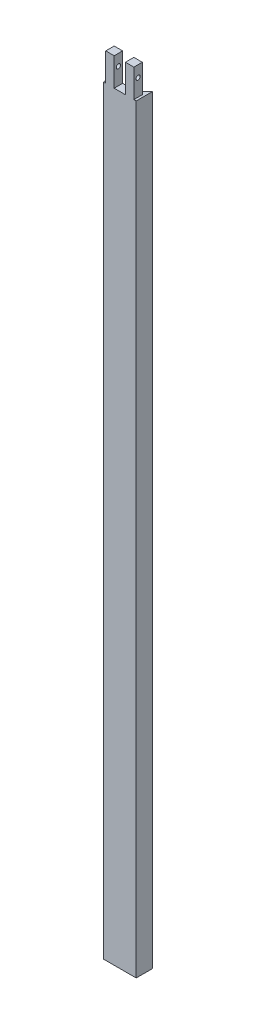
ISO-10303-21;
HEADER;
FILE_DESCRIPTION(('STEP AP214'),'2;1');
FILE_NAME('part.step','',(''),(''),'','','');
FILE_SCHEMA(('AUTOMOTIVE_DESIGN { 1 0 10303 214 1 1 1 1 }'));
ENDSEC;
DATA;
#1=APPLICATION_CONTEXT('core data for automotive mechanical design processes');
#2=APPLICATION_PROTOCOL_DEFINITION('international standard','automotive_design',2000,#1);
#3=PRODUCT_CONTEXT('',#1,'mechanical');
#4=PRODUCT('Part','Part','',(#3));
#5=PRODUCT_RELATED_PRODUCT_CATEGORY('part','',(#4));
#6=PRODUCT_DEFINITION_FORMATION('','',#4);
#7=PRODUCT_DEFINITION_CONTEXT('part definition',#1,'design');
#8=PRODUCT_DEFINITION('design','',#6,#7);
#9=PRODUCT_DEFINITION_SHAPE('','',#8);
#10=(LENGTH_UNIT() NAMED_UNIT(*) SI_UNIT(.MILLI.,.METRE.));
#11=(NAMED_UNIT(*) PLANE_ANGLE_UNIT() SI_UNIT($,.RADIAN.));
#12=(NAMED_UNIT(*) SI_UNIT($,.STERADIAN.) SOLID_ANGLE_UNIT());
#13=UNCERTAINTY_MEASURE_WITH_UNIT(LENGTH_MEASURE(1.E-05),#10,'distance_accuracy_value','');
#14=(GEOMETRIC_REPRESENTATION_CONTEXT(3) GLOBAL_UNCERTAINTY_ASSIGNED_CONTEXT((#13)) GLOBAL_UNIT_ASSIGNED_CONTEXT((#10,
#11,#12)) REPRESENTATION_CONTEXT('',''));
#15=CARTESIAN_POINT('',(0.,0.,0.));
#16=DIRECTION('',(0.,0.,1.));
#17=DIRECTION('',(1.,0.,0.));
#18=AXIS2_PLACEMENT_3D('',#15,#16,#17);
#19=CARTESIAN_POINT('',(0.,0.,3.));
#20=DIRECTION('',(0.,-1.,0.));
#21=DIRECTION('',(1.,0.,0.));
#22=AXIS2_PLACEMENT_3D('',#19,#20,#21);
#23=PLANE('',#22);
#24=DIRECTION('',(0.,0.,-1.));
#25=VECTOR('',#24,1.);
#26=CARTESIAN_POINT('',(2.00000000000002,0.,3.));
#27=LINE('',#26,#25);
#28=CARTESIAN_POINT('',(2.00000000000002,0.,3.));
#29=VERTEX_POINT('',#28);
#30=CARTESIAN_POINT('',(2.00000000000002,0.,0.));
#31=VERTEX_POINT('',#30);
#32=EDGE_CURVE('E169',#29,#31,#27,.T.);
#33=ORIENTED_EDGE('',*,*,#32,.F.);
#34=DIRECTION('',(-1.,0.,0.));
#35=VECTOR('',#34,1.);
#36=CARTESIAN_POINT('',(0.,0.,3.));
#37=LINE('',#36,#35);
#38=CARTESIAN_POINT('',(2.82842712474618,0.,3.));
#39=VERTEX_POINT('',#38);
#40=EDGE_CURVE('E261',#39,#29,#37,.T.);
#41=ORIENTED_EDGE('',*,*,#40,.F.);
#42=DIRECTION('',(0.,0.,1.));
#43=VECTOR('',#42,1.);
#44=CARTESIAN_POINT('',(2.82842712474619,0.,-2.82842712474619));
#45=LINE('',#44,#43);
#46=CARTESIAN_POINT('',(2.82842712474619,0.,-2.82842712474619));
#47=VERTEX_POINT('',#46);
#48=EDGE_CURVE('E242',#47,#39,#45,.T.);
#49=ORIENTED_EDGE('',*,*,#48,.F.);
#50=DIRECTION('',(0.707106781186546,0.,-0.707106781186549));
#51=VECTOR('',#50,1.);
#52=CARTESIAN_POINT('',(0.,0.,0.));
#53=LINE('',#52,#51);
#54=CARTESIAN_POINT('',(0.,0.,0.));
#55=VERTEX_POINT('',#54);
#56=EDGE_CURVE('E238',#55,#47,#53,.T.);
#57=ORIENTED_EDGE('',*,*,#56,.F.);
#58=DIRECTION('',(-1.,0.,0.));
#59=VECTOR('',#58,1.);
#60=CARTESIAN_POINT('',(2.00000000000002,0.,0.));
#61=LINE('',#60,#59);
#62=EDGE_CURVE('E57',#31,#55,#61,.T.);
#63=ORIENTED_EDGE('',*,*,#62,.F.);
#64=EDGE_LOOP('',(#33,#41,#49,#57,#63));
#65=FACE_BOUND('',#64,.T.);
#66=ADVANCED_FACE('F39',(#65),#23,.F.);
#67=DIRECTION('',(0.,0.,1.));
#68=VECTOR('',#67,1.);
#69=CARTESIAN_POINT('',(-0.999999999999984,0.,3.));
#70=LINE('',#69,#68);
#71=CARTESIAN_POINT('',(-0.999999999999984,0.,0.));
#72=VERTEX_POINT('',#71);
#73=CARTESIAN_POINT('',(-0.999999999999984,0.,3.));
#74=VERTEX_POINT('',#73);
#75=EDGE_CURVE('E166',#72,#74,#70,.T.);
#76=ORIENTED_EDGE('',*,*,#75,.F.);
#77=DIRECTION('',(-1.,0.,0.));
#78=VECTOR('',#77,1.);
#79=CARTESIAN_POINT('',(0.,0.,0.));
#80=LINE('',#79,#78);
#81=CARTESIAN_POINT('',(-4.99999999999998,0.,0.));
#82=VERTEX_POINT('',#81);
#83=EDGE_CURVE('E270',#72,#82,#80,.T.);
#84=ORIENTED_EDGE('',*,*,#83,.T.);
#85=DIRECTION('',(0.,0.,-1.));
#86=VECTOR('',#85,1.);
#87=CARTESIAN_POINT('',(-4.99999999999998,0.,3.));
#88=LINE('',#87,#86);
#89=CARTESIAN_POINT('',(-4.99999999999998,0.,3.));
#90=VERTEX_POINT('',#89);
#91=EDGE_CURVE('E176',#90,#82,#88,.T.);
#92=ORIENTED_EDGE('',*,*,#91,.F.);
#93=EDGE_CURVE('E65',#74,#90,#37,.T.);
#94=ORIENTED_EDGE('',*,*,#93,.F.);
#95=EDGE_LOOP('',(#76,#84,#92,#94));
#96=FACE_BOUND('',#95,.T.);
#97=ADVANCED_FACE('F290',(#96),#23,.F.);
#98=DIRECTION('',(0.,0.,1.));
#99=VECTOR('',#98,1.);
#100=CARTESIAN_POINT('',(-7.99999999999999,0.,3.));
#101=LINE('',#100,#99);
#102=CARTESIAN_POINT('',(-7.99999999999998,0.,0.));
#103=VERTEX_POINT('',#102);
#104=CARTESIAN_POINT('',(-7.99999999999999,0.,3.));
#105=VERTEX_POINT('',#104);
#106=EDGE_CURVE('E171',#103,#105,#101,.T.);
#107=ORIENTED_EDGE('',*,*,#106,.F.);
#108=DIRECTION('',(-1.,0.,0.));
#109=VECTOR('',#108,1.);
#110=CARTESIAN_POINT('',(-7.99999999999998,0.,0.));
#111=LINE('',#110,#109);
#112=CARTESIAN_POINT('',(-5.99999999999997,0.,0.));
#113=VERTEX_POINT('',#112);
#114=EDGE_CURVE('E11',#113,#103,#111,.T.);
#115=ORIENTED_EDGE('',*,*,#114,.F.);
#116=DIRECTION('',(0.707106781186546,0.,0.707106781186549));
#117=VECTOR('',#116,1.);
#118=CARTESIAN_POINT('',(-5.99999999999997,0.,0.));
#119=LINE('',#118,#117);
#120=CARTESIAN_POINT('',(-8.82842712474615,0.,-2.8284271247462));
#121=VERTEX_POINT('',#120);
#122=EDGE_CURVE('E219',#121,#113,#119,.T.);
#123=ORIENTED_EDGE('',*,*,#122,.F.);
#124=DIRECTION('',(0.,0.,-1.));
#125=VECTOR('',#124,1.);
#126=CARTESIAN_POINT('',(-8.82842712474615,0.,-2.8284271247462));
#127=LINE('',#126,#125);
#128=CARTESIAN_POINT('',(-8.82842712474615,0.,3.));
#129=VERTEX_POINT('',#128);
#130=EDGE_CURVE('E215',#129,#121,#127,.T.);
#131=ORIENTED_EDGE('',*,*,#130,.F.);
#132=EDGE_CURVE('E265',#105,#129,#37,.T.);
#133=ORIENTED_EDGE('',*,*,#132,.F.);
#134=EDGE_LOOP('',(#107,#115,#123,#131,#133));
#135=FACE_BOUND('',#134,.T.);
#136=ADVANCED_FACE('F41',(#135),#23,.F.);
#137=CARTESIAN_POINT('',(0.,-270.,3.));
#138=DIRECTION('',(0.,1.,0.));
#139=DIRECTION('',(0.,0.,1.));
#140=AXIS2_PLACEMENT_3D('',#137,#138,#139);
#141=PLANE('',#140);
#142=DIRECTION('',(1.,0.,0.));
#143=VECTOR('',#142,1.);
#144=CARTESIAN_POINT('',(0.,-270.,0.));
#145=LINE('',#144,#143);
#146=CARTESIAN_POINT('',(-5.99999999999997,-270.,0.));
#147=VERTEX_POINT('',#146);
#148=CARTESIAN_POINT('',(0.,-270.,0.));
#149=VERTEX_POINT('',#148);
#150=EDGE_CURVE('E276',#147,#149,#145,.T.);
#151=ORIENTED_EDGE('',*,*,#150,.T.);
#152=DIRECTION('',(0.707106781186546,0.,-0.707106781186549));
#153=VECTOR('',#152,1.);
#154=CARTESIAN_POINT('',(0.,-270.,0.));
#155=LINE('',#154,#153);
#156=CARTESIAN_POINT('',(2.82842712474619,-270.,-2.82842712474619));
#157=VERTEX_POINT('',#156);
#158=EDGE_CURVE('E235',#149,#157,#155,.T.);
#159=ORIENTED_EDGE('',*,*,#158,.T.);
#160=DIRECTION('',(0.,0.,1.));
#161=VECTOR('',#160,1.);
#162=CARTESIAN_POINT('',(2.82842712474619,-270.,-2.82842712474619));
#163=LINE('',#162,#161);
#164=CARTESIAN_POINT('',(2.82842712474618,-270.,3.));
#165=VERTEX_POINT('',#164);
#166=EDGE_CURVE('E243',#157,#165,#163,.T.);
#167=ORIENTED_EDGE('',*,*,#166,.T.);
#168=DIRECTION('',(1.,0.,0.));
#169=VECTOR('',#168,1.);
#170=CARTESIAN_POINT('',(0.,-270.,3.));
#171=LINE('',#170,#169);
#172=CARTESIAN_POINT('',(-8.82842712474615,-270.,3.));
#173=VERTEX_POINT('',#172);
#174=EDGE_CURVE('E49',#173,#165,#171,.T.);
#175=ORIENTED_EDGE('',*,*,#174,.F.);
#176=DIRECTION('',(0.,0.,-1.));
#177=VECTOR('',#176,1.);
#178=CARTESIAN_POINT('',(-8.82842712474615,-270.,-2.8284271247462));
#179=LINE('',#178,#177);
#180=CARTESIAN_POINT('',(-8.82842712474615,-270.,-2.8284271247462));
#181=VERTEX_POINT('',#180);
#182=EDGE_CURVE('E214',#173,#181,#179,.T.);
#183=ORIENTED_EDGE('',*,*,#182,.T.);
#184=DIRECTION('',(0.707106781186546,0.,0.707106781186549));
#185=VECTOR('',#184,1.);
#186=CARTESIAN_POINT('',(-5.99999999999997,-270.,0.));
#187=LINE('',#186,#185);
#188=EDGE_CURVE('E220',#181,#147,#187,.T.);
#189=ORIENTED_EDGE('',*,*,#188,.T.);
#190=EDGE_LOOP('',(#151,#159,#167,#175,#183,#189));
#191=FACE_BOUND('',#190,.T.);
#192=ADVANCED_FACE('F317',(#191),#141,.F.);
#193=CARTESIAN_POINT('',(0.,0.,3.));
#194=DIRECTION('',(0.,0.,-1.));
#195=DIRECTION('',(-1.,0.,0.));
#196=AXIS2_PLACEMENT_3D('',#193,#194,#195);
#197=PLANE('',#196);
#198=ORIENTED_EDGE('',*,*,#174,.T.);
#199=DIRECTION('',(0.,-1.,0.));
#200=VECTOR('',#199,1.);
#201=CARTESIAN_POINT('',(2.82842712474618,0.,3.));
#202=LINE('',#201,#200);
#203=EDGE_CURVE('E254',#39,#165,#202,.T.);
#204=ORIENTED_EDGE('',*,*,#203,.F.);
#205=ORIENTED_EDGE('',*,*,#40,.T.);
#206=DIRECTION('',(0.,-1.,0.));
#207=VECTOR('',#206,1.);
#208=CARTESIAN_POINT('',(2.00000000000002,10.,3.));
#209=LINE('',#208,#207);
#210=CARTESIAN_POINT('',(2.00000000000002,10.,3.));
#211=VERTEX_POINT('',#210);
#212=EDGE_CURVE('E320',#211,#29,#209,.T.);
#213=ORIENTED_EDGE('',*,*,#212,.F.);
#214=DIRECTION('',(1.,0.,0.));
#215=VECTOR('',#214,1.);
#216=CARTESIAN_POINT('',(2.00000000000002,10.,3.));
#217=LINE('',#216,#215);
#218=CARTESIAN_POINT('',(-0.999999999999986,10.,3.));
#219=VERTEX_POINT('',#218);
#220=EDGE_CURVE('E161',#219,#211,#217,.T.);
#221=ORIENTED_EDGE('',*,*,#220,.F.);
#222=DIRECTION('',(0.,-1.,0.));
#223=VECTOR('',#222,1.);
#224=CARTESIAN_POINT('',(-0.999999999999986,10.,3.));
#225=LINE('',#224,#223);
#226=EDGE_CURVE('E178',#219,#74,#225,.T.);
#227=ORIENTED_EDGE('',*,*,#226,.T.);
#228=ORIENTED_EDGE('',*,*,#93,.T.);
#229=DIRECTION('',(0.,-1.,0.));
#230=VECTOR('',#229,1.);
#231=CARTESIAN_POINT('',(-4.99999999999999,10.,3.));
#232=LINE('',#231,#230);
#233=CARTESIAN_POINT('',(-4.99999999999999,10.,3.));
#234=VERTEX_POINT('',#233);
#235=EDGE_CURVE('E206',#234,#90,#232,.T.);
#236=ORIENTED_EDGE('',*,*,#235,.F.);
#237=DIRECTION('',(1.,0.,0.));
#238=VECTOR('',#237,1.);
#239=CARTESIAN_POINT('',(-7.99999999999999,10.,3.));
#240=LINE('',#239,#238);
#241=CARTESIAN_POINT('',(-7.99999999999999,10.,3.));
#242=VERTEX_POINT('',#241);
#243=EDGE_CURVE('E186',#242,#234,#240,.T.);
#244=ORIENTED_EDGE('',*,*,#243,.F.);
#245=DIRECTION('',(0.,-1.,0.));
#246=VECTOR('',#245,1.);
#247=CARTESIAN_POINT('',(-7.99999999999999,10.,3.));
#248=LINE('',#247,#246);
#249=EDGE_CURVE('E210',#242,#105,#248,.T.);
#250=ORIENTED_EDGE('',*,*,#249,.T.);
#251=ORIENTED_EDGE('',*,*,#132,.T.);
#252=DIRECTION('',(0.,-1.,0.));
#253=VECTOR('',#252,1.);
#254=CARTESIAN_POINT('',(-8.82842712474615,0.,3.));
#255=LINE('',#254,#253);
#256=EDGE_CURVE('E231',#129,#173,#255,.T.);
#257=ORIENTED_EDGE('',*,*,#256,.T.);
#258=EDGE_LOOP('',(#198,#204,#205,#213,#221,#227,#228,#236,#244,#250,#251,#257));
#259=FACE_BOUND('',#258,.T.);
#260=ADVANCED_FACE('F287',(#259),#197,.F.);
#261=CARTESIAN_POINT('',(0.,0.,0.));
#262=DIRECTION('',(0.,0.,-1.));
#263=DIRECTION('',(-1.,0.,0.));
#264=AXIS2_PLACEMENT_3D('',#261,#262,#263);
#265=PLANE('',#264);
#266=DIRECTION('',(0.,1.,0.));
#267=VECTOR('',#266,1.);
#268=CARTESIAN_POINT('',(0.,0.,0.));
#269=LINE('',#268,#267);
#270=EDGE_CURVE('E258',#149,#55,#269,.T.);
#271=ORIENTED_EDGE('',*,*,#270,.F.);
#272=ORIENTED_EDGE('',*,*,#150,.F.);
#273=DIRECTION('',(0.,-1.,0.));
#274=VECTOR('',#273,1.);
#275=CARTESIAN_POINT('',(-6.,0.,0.));
#276=LINE('',#275,#274);
#277=EDGE_CURVE('E273',#113,#147,#276,.T.);
#278=ORIENTED_EDGE('',*,*,#277,.F.);
#279=ORIENTED_EDGE('',*,*,#114,.T.);
#280=DIRECTION('',(0.,-1.,0.));
#281=VECTOR('',#280,1.);
#282=CARTESIAN_POINT('',(-7.99999999999999,10.,0.));
#283=LINE('',#282,#281);
#284=CARTESIAN_POINT('',(-7.99999999999999,10.,0.));
#285=VERTEX_POINT('',#284);
#286=EDGE_CURVE('E194',#285,#103,#283,.T.);
#287=ORIENTED_EDGE('',*,*,#286,.F.);
#288=DIRECTION('',(-1.,0.,0.));
#289=VECTOR('',#288,1.);
#290=CARTESIAN_POINT('',(-7.99999999999999,10.,0.));
#291=LINE('',#290,#289);
#292=CARTESIAN_POINT('',(-4.99999999999999,10.,0.));
#293=VERTEX_POINT('',#292);
#294=EDGE_CURVE('E192',#293,#285,#291,.T.);
#295=ORIENTED_EDGE('',*,*,#294,.F.);
#296=DIRECTION('',(0.,-1.,0.));
#297=VECTOR('',#296,1.);
#298=CARTESIAN_POINT('',(-4.99999999999999,10.,0.));
#299=LINE('',#298,#297);
#300=EDGE_CURVE('E202',#293,#82,#299,.T.);
#301=ORIENTED_EDGE('',*,*,#300,.T.);
#302=ORIENTED_EDGE('',*,*,#83,.F.);
#303=DIRECTION('',(0.,-1.,0.));
#304=VECTOR('',#303,1.);
#305=CARTESIAN_POINT('',(-0.999999999999986,10.,0.));
#306=LINE('',#305,#304);
#307=CARTESIAN_POINT('',(-0.999999999999986,10.,0.));
#308=VERTEX_POINT('',#307);
#309=EDGE_CURVE('E151',#308,#72,#306,.T.);
#310=ORIENTED_EDGE('',*,*,#309,.F.);
#311=DIRECTION('',(-1.,0.,0.));
#312=VECTOR('',#311,1.);
#313=CARTESIAN_POINT('',(2.00000000000001,10.,0.));
#314=LINE('',#313,#312);
#315=CARTESIAN_POINT('',(2.00000000000001,10.,0.));
#316=VERTEX_POINT('',#315);
#317=EDGE_CURVE('E144',#316,#308,#314,.T.);
#318=ORIENTED_EDGE('',*,*,#317,.F.);
#319=DIRECTION('',(0.,-1.,0.));
#320=VECTOR('',#319,1.);
#321=CARTESIAN_POINT('',(2.00000000000001,10.,0.));
#322=LINE('',#321,#320);
#323=EDGE_CURVE('E148',#316,#31,#322,.T.);
#324=ORIENTED_EDGE('',*,*,#323,.T.);
#325=ORIENTED_EDGE('',*,*,#62,.T.);
#326=EDGE_LOOP('',(#271,#272,#278,#279,#287,#295,#301,#302,#310,#318,#324,#325));
#327=FACE_BOUND('',#326,.T.);
#328=ADVANCED_FACE('F146',(#327),#265,.T.);
#329=CARTESIAN_POINT('',(2.82842712474619,0.,-2.82842712474619));
#330=DIRECTION('',(1.,0.,0.));
#331=DIRECTION('',(0.,0.,-1.));
#332=AXIS2_PLACEMENT_3D('',#329,#330,#331);
#333=PLANE('',#332);
#334=ORIENTED_EDGE('',*,*,#166,.F.);
#335=DIRECTION('',(0.,-1.,0.));
#336=VECTOR('',#335,1.);
#337=CARTESIAN_POINT('',(2.82842712474619,0.,-2.82842712474619));
#338=LINE('',#337,#336);
#339=EDGE_CURVE('E247',#47,#157,#338,.T.);
#340=ORIENTED_EDGE('',*,*,#339,.F.);
#341=ORIENTED_EDGE('',*,*,#48,.T.);
#342=ORIENTED_EDGE('',*,*,#203,.T.);
#343=EDGE_LOOP('',(#334,#340,#341,#342));
#344=FACE_BOUND('',#343,.T.);
#345=ADVANCED_FACE('F315',(#344),#333,.T.);
#346=CARTESIAN_POINT('',(0.,0.,0.));
#347=DIRECTION('',(-0.707106781186549,0.,-0.707106781186546));
#348=DIRECTION('',(-0.707106781186546,0.,0.707106781186549));
#349=AXIS2_PLACEMENT_3D('',#346,#347,#348);
#350=PLANE('',#349);
#351=ORIENTED_EDGE('',*,*,#158,.F.);
#352=ORIENTED_EDGE('',*,*,#270,.T.);
#353=ORIENTED_EDGE('',*,*,#56,.T.);
#354=ORIENTED_EDGE('',*,*,#339,.T.);
#355=EDGE_LOOP('',(#351,#352,#353,#354));
#356=FACE_BOUND('',#355,.T.);
#357=ADVANCED_FACE('F319',(#356),#350,.T.);
#358=CARTESIAN_POINT('',(-8.82842712474615,0.,-2.8284271247462));
#359=DIRECTION('',(-1.,0.,0.));
#360=DIRECTION('',(0.,0.,1.));
#361=AXIS2_PLACEMENT_3D('',#358,#359,#360);
#362=PLANE('',#361);
#363=ORIENTED_EDGE('',*,*,#182,.F.);
#364=ORIENTED_EDGE('',*,*,#256,.F.);
#365=ORIENTED_EDGE('',*,*,#130,.T.);
#366=DIRECTION('',(0.,-1.,0.));
#367=VECTOR('',#366,1.);
#368=CARTESIAN_POINT('',(-8.82842712474615,0.,-2.8284271247462));
#369=LINE('',#368,#367);
#370=EDGE_CURVE('E224',#121,#181,#369,.T.);
#371=ORIENTED_EDGE('',*,*,#370,.T.);
#372=EDGE_LOOP('',(#363,#364,#365,#371));
#373=FACE_BOUND('',#372,.T.);
#374=ADVANCED_FACE('F311',(#373),#362,.T.);
#375=CARTESIAN_POINT('',(-5.99999999999997,0.,0.));
#376=DIRECTION('',(0.707106781186549,0.,-0.707106781186546));
#377=DIRECTION('',(-0.707106781186546,0.,-0.707106781186549));
#378=AXIS2_PLACEMENT_3D('',#375,#376,#377);
#379=PLANE('',#378);
#380=ORIENTED_EDGE('',*,*,#188,.F.);
#381=ORIENTED_EDGE('',*,*,#370,.F.);
#382=ORIENTED_EDGE('',*,*,#122,.T.);
#383=ORIENTED_EDGE('',*,*,#277,.T.);
#384=EDGE_LOOP('',(#380,#381,#382,#383));
#385=FACE_BOUND('',#384,.T.);
#386=ADVANCED_FACE('F308',(#385),#379,.T.);
#387=CARTESIAN_POINT('',(-7.99999999999999,10.,3.));
#388=DIRECTION('',(1.,0.,0.));
#389=DIRECTION('',(0.,0.,-1.));
#390=AXIS2_PLACEMENT_3D('',#387,#388,#389);
#391=PLANE('',#390);
#392=CARTESIAN_POINT('',(-7.99999999999999,6.,1.50000000000001));
#393=DIRECTION('',(1.,0.,0.));
#394=DIRECTION('',(0.,0.,-1.));
#395=AXIS2_PLACEMENT_3D('',#392,#393,#394);
#396=CIRCLE('',#395,0.75);
#397=CARTESIAN_POINT('',(-7.99999999999999,6.,0.750000000000006));
#398=VERTEX_POINT('',#397);
#399=EDGE_CURVE('E332',#398,#398,#396,.T.);
#400=ORIENTED_EDGE('',*,*,#399,.T.);
#401=EDGE_LOOP('',(#400));
#402=FACE_BOUND('',#401,.T.);
#403=ORIENTED_EDGE('',*,*,#106,.T.);
#404=ORIENTED_EDGE('',*,*,#249,.F.);
#405=DIRECTION('',(0.,0.,1.));
#406=VECTOR('',#405,1.);
#407=CARTESIAN_POINT('',(-7.99999999999999,10.,3.));
#408=LINE('',#407,#406);
#409=EDGE_CURVE('E182',#285,#242,#408,.T.);
#410=ORIENTED_EDGE('',*,*,#409,.F.);
#411=ORIENTED_EDGE('',*,*,#286,.T.);
#412=EDGE_LOOP('',(#403,#404,#410,#411));
#413=FACE_BOUND('',#412,.T.);
#414=ADVANCED_FACE('F301',(#402,#413),#391,.F.);
#415=CARTESIAN_POINT('',(-4.99999999999999,10.,3.));
#416=DIRECTION('',(-1.,0.,0.));
#417=DIRECTION('',(0.,-1.,0.));
#418=AXIS2_PLACEMENT_3D('',#415,#416,#417);
#419=PLANE('',#418);
#420=CARTESIAN_POINT('',(-4.99999999999998,6.,1.5));
#421=DIRECTION('',(-1.,0.,0.));
#422=DIRECTION('',(0.,-1.,0.));
#423=AXIS2_PLACEMENT_3D('',#420,#421,#422);
#424=CIRCLE('',#423,0.75);
#425=CARTESIAN_POINT('',(-4.99999999999998,5.25,1.5));
#426=VERTEX_POINT('',#425);
#427=EDGE_CURVE('E339',#426,#426,#424,.T.);
#428=ORIENTED_EDGE('',*,*,#427,.T.);
#429=EDGE_LOOP('',(#428));
#430=FACE_BOUND('',#429,.T.);
#431=ORIENTED_EDGE('',*,*,#91,.T.);
#432=ORIENTED_EDGE('',*,*,#300,.F.);
#433=DIRECTION('',(0.,0.,-1.));
#434=VECTOR('',#433,1.);
#435=CARTESIAN_POINT('',(-4.99999999999999,10.,3.));
#436=LINE('',#435,#434);
#437=EDGE_CURVE('E189',#234,#293,#436,.T.);
#438=ORIENTED_EDGE('',*,*,#437,.F.);
#439=ORIENTED_EDGE('',*,*,#235,.T.);
#440=EDGE_LOOP('',(#431,#432,#438,#439));
#441=FACE_BOUND('',#440,.T.);
#442=ADVANCED_FACE('F293',(#430,#441),#419,.F.);
#443=CARTESIAN_POINT('',(0.,10.,0.));
#444=DIRECTION('',(0.,-1.,0.));
#445=DIRECTION('',(1.,0.,0.));
#446=AXIS2_PLACEMENT_3D('',#443,#444,#445);
#447=PLANE('',#446);
#448=ORIENTED_EDGE('',*,*,#409,.T.);
#449=ORIENTED_EDGE('',*,*,#243,.T.);
#450=ORIENTED_EDGE('',*,*,#437,.T.);
#451=ORIENTED_EDGE('',*,*,#294,.T.);
#452=EDGE_LOOP('',(#448,#449,#450,#451));
#453=FACE_BOUND('',#452,.T.);
#454=ADVANCED_FACE('F296',(#453),#447,.F.);
#455=CARTESIAN_POINT('',(2.00000000000002,10.,3.));
#456=DIRECTION('',(-1.,0.,0.));
#457=DIRECTION('',(0.,0.,1.));
#458=AXIS2_PLACEMENT_3D('',#455,#456,#457);
#459=PLANE('',#458);
#460=CARTESIAN_POINT('',(2.00000000000002,6.,1.5));
#461=DIRECTION('',(1.,0.,0.));
#462=DIRECTION('',(0.,0.,-1.));
#463=AXIS2_PLACEMENT_3D('',#460,#461,#462);
#464=CIRCLE('',#463,0.75);
#465=CARTESIAN_POINT('',(2.00000000000002,6.,0.75));
#466=VERTEX_POINT('',#465);
#467=EDGE_CURVE('E343',#466,#466,#464,.T.);
#468=ORIENTED_EDGE('',*,*,#467,.F.);
#469=EDGE_LOOP('',(#468));
#470=FACE_BOUND('',#469,.T.);
#471=ORIENTED_EDGE('',*,*,#32,.T.);
#472=ORIENTED_EDGE('',*,*,#323,.F.);
#473=DIRECTION('',(0.,0.,-1.));
#474=VECTOR('',#473,1.);
#475=CARTESIAN_POINT('',(2.00000000000002,10.,3.));
#476=LINE('',#475,#474);
#477=EDGE_CURVE('E156',#211,#316,#476,.T.);
#478=ORIENTED_EDGE('',*,*,#477,.F.);
#479=ORIENTED_EDGE('',*,*,#212,.T.);
#480=EDGE_LOOP('',(#471,#472,#478,#479));
#481=FACE_BOUND('',#480,.T.);
#482=ADVANCED_FACE('F168',(#470,#481),#459,.F.);
#483=CARTESIAN_POINT('',(-0.999999999999986,10.,3.));
#484=DIRECTION('',(1.,0.,0.));
#485=DIRECTION('',(0.,1.,0.));
#486=AXIS2_PLACEMENT_3D('',#483,#484,#485);
#487=PLANE('',#486);
#488=CARTESIAN_POINT('',(-0.999999999999987,6.,1.5));
#489=DIRECTION('',(1.,0.,0.));
#490=DIRECTION('',(0.,1.,0.));
#491=AXIS2_PLACEMENT_3D('',#488,#489,#490);
#492=CIRCLE('',#491,0.75);
#493=CARTESIAN_POINT('',(-0.999999999999987,6.75,1.5));
#494=VERTEX_POINT('',#493);
#495=EDGE_CURVE('E43',#494,#494,#492,.T.);
#496=ORIENTED_EDGE('',*,*,#495,.T.);
#497=EDGE_LOOP('',(#496));
#498=FACE_BOUND('',#497,.T.);
#499=ORIENTED_EDGE('',*,*,#75,.T.);
#500=ORIENTED_EDGE('',*,*,#226,.F.);
#501=DIRECTION('',(0.,0.,1.));
#502=VECTOR('',#501,1.);
#503=CARTESIAN_POINT('',(-0.999999999999986,10.,3.));
#504=LINE('',#503,#502);
#505=EDGE_CURVE('E155',#308,#219,#504,.T.);
#506=ORIENTED_EDGE('',*,*,#505,.F.);
#507=ORIENTED_EDGE('',*,*,#309,.T.);
#508=EDGE_LOOP('',(#499,#500,#506,#507));
#509=FACE_BOUND('',#508,.T.);
#510=ADVANCED_FACE('F352',(#498,#509),#487,.F.);
#511=CARTESIAN_POINT('',(0.,10.,0.));
#512=DIRECTION('',(0.,1.,0.));
#513=DIRECTION('',(-1.,0.,0.));
#514=AXIS2_PLACEMENT_3D('',#511,#512,#513);
#515=PLANE('',#514);
#516=ORIENTED_EDGE('',*,*,#477,.T.);
#517=ORIENTED_EDGE('',*,*,#317,.T.);
#518=ORIENTED_EDGE('',*,*,#505,.T.);
#519=ORIENTED_EDGE('',*,*,#220,.T.);
#520=EDGE_LOOP('',(#516,#517,#518,#519));
#521=FACE_BOUND('',#520,.T.);
#522=ADVANCED_FACE('F159',(#521),#515,.T.);
#523=CARTESIAN_POINT('',(-38.,5.99999999999999,1.50000000000002));
#524=DIRECTION('',(1.,0.,0.));
#525=DIRECTION('',(0.,0.,-1.));
#526=AXIS2_PLACEMENT_3D('',#523,#524,#525);
#527=CYLINDRICAL_SURFACE('',#526,0.75);
#528=ORIENTED_EDGE('',*,*,#467,.T.);
#529=EDGE_LOOP('',(#528));
#530=FACE_BOUND('',#529,.T.);
#531=ORIENTED_EDGE('',*,*,#495,.F.);
#532=EDGE_LOOP('',(#531));
#533=FACE_BOUND('',#532,.T.);
#534=ADVANCED_FACE('F355',(#530,#533),#527,.F.);
#535=ORIENTED_EDGE('',*,*,#427,.F.);
#536=EDGE_LOOP('',(#535));
#537=FACE_BOUND('',#536,.T.);
#538=ORIENTED_EDGE('',*,*,#399,.F.);
#539=EDGE_LOOP('',(#538));
#540=FACE_BOUND('',#539,.T.);
#541=ADVANCED_FACE('F357',(#537,#540),#527,.F.);
#542=CLOSED_SHELL('',(#66,#97,#136,#192,#260,#328,#345,#357,#374,#386,#414,#442,#454,#482,#510,
#522,#534,#541));
#543=MANIFOLD_SOLID_BREP('B2',#542);
#544=ADVANCED_BREP_SHAPE_REPRESENTATION('',(#18,#543),#14);
#545=SHAPE_DEFINITION_REPRESENTATION(#9,#544);
ENDSEC;
END-ISO-10303-21;
